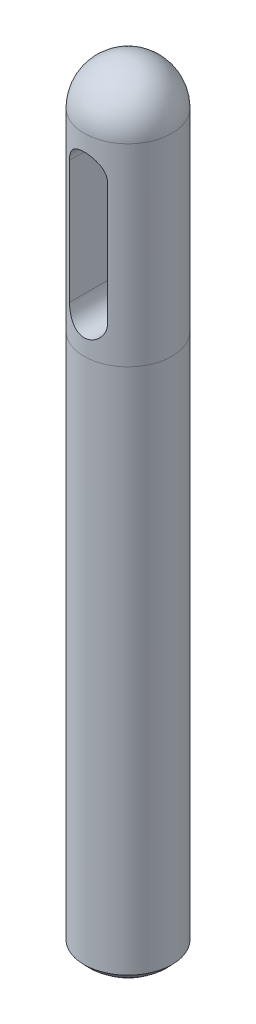
ISO-10303-21;
HEADER;
FILE_DESCRIPTION(('STEP AP214'),'2;1');
FILE_NAME('part.step','',(''),(''),'','','');
FILE_SCHEMA(('AUTOMOTIVE_DESIGN { 1 0 10303 214 1 1 1 1 }'));
ENDSEC;
DATA;
#1=APPLICATION_CONTEXT('core data for automotive mechanical design processes');
#2=APPLICATION_PROTOCOL_DEFINITION('international standard','automotive_design',2000,#1);
#3=PRODUCT_CONTEXT('',#1,'mechanical');
#4=PRODUCT('Part','Part','',(#3));
#5=PRODUCT_RELATED_PRODUCT_CATEGORY('part','',(#4));
#6=PRODUCT_DEFINITION_FORMATION('','',#4);
#7=PRODUCT_DEFINITION_CONTEXT('part definition',#1,'design');
#8=PRODUCT_DEFINITION('design','',#6,#7);
#9=PRODUCT_DEFINITION_SHAPE('','',#8);
#10=(LENGTH_UNIT() NAMED_UNIT(*) SI_UNIT(.MILLI.,.METRE.));
#11=(NAMED_UNIT(*) PLANE_ANGLE_UNIT() SI_UNIT($,.RADIAN.));
#12=(NAMED_UNIT(*) SI_UNIT($,.STERADIAN.) SOLID_ANGLE_UNIT());
#13=UNCERTAINTY_MEASURE_WITH_UNIT(LENGTH_MEASURE(1.E-05),#10,'distance_accuracy_value','');
#14=(GEOMETRIC_REPRESENTATION_CONTEXT(3) GLOBAL_UNCERTAINTY_ASSIGNED_CONTEXT((#13)) GLOBAL_UNIT_ASSIGNED_CONTEXT((#10,
#11,#12)) REPRESENTATION_CONTEXT('',''));
#15=CARTESIAN_POINT('',(0.,0.,0.));
#16=DIRECTION('',(0.,0.,1.));
#17=DIRECTION('',(1.,0.,0.));
#18=AXIS2_PLACEMENT_3D('',#15,#16,#17);
#19=CARTESIAN_POINT('',(0.,0.,0.));
#20=DIRECTION('',(0.,-1.,0.));
#21=DIRECTION('',(1.,0.,0.));
#22=AXIS2_PLACEMENT_3D('',#19,#20,#21);
#23=CYLINDRICAL_SURFACE('',#22,2.49771864426145);
#24=CARTESIAN_POINT('',(-1.08156310943295,32.,2.25140393226204));
#25=CARTESIAN_POINT('',(-1.08156462459326,31.9711286747839,2.25139958166966));
#26=CARTESIAN_POINT('',(-1.08040632023386,31.9422729112845,2.2519599835213));
#27=CARTESIAN_POINT('',(-1.07579662459928,31.884799648412,2.25416724154309));
#28=CARTESIAN_POINT('',(-1.07234626010404,31.8561820481581,2.2558136112272));
#29=CARTESIAN_POINT('',(-1.05864428238476,31.7712616524154,2.26229476426738));
#30=CARTESIAN_POINT('',(-1.04504111585666,31.7155787319075,2.26867251849921));
#31=CARTESIAN_POINT('',(-1.00947281413111,31.6075996259835,2.2847181118528));
#32=CARTESIAN_POINT('',(-0.987518788030334,31.5552990487394,2.29438157820754));
#33=CARTESIAN_POINT('',(-0.935946284783608,31.4550559864309,2.31589778574997));
#34=CARTESIAN_POINT('',(-0.906319100733386,31.4071185363628,2.32775300957213));
#35=CARTESIAN_POINT('',(-0.838144605373987,31.3138298654569,2.35319179935182));
#36=CARTESIAN_POINT('',(-0.799166139929148,31.2688104634779,2.36683653303169));
#37=CARTESIAN_POINT('',(-0.714304200124362,31.1857049623009,2.39381481322249));
#38=CARTESIAN_POINT('',(-0.668419185045317,31.1476204143358,2.40714828952929));
#39=CARTESIAN_POINT('',(-0.568362170274591,31.077697998134,2.43276606280889));
#40=CARTESIAN_POINT('',(-0.513899661221928,31.0462437958692,2.44497020050376));
#41=CARTESIAN_POINT('',(-0.399831615298517,30.9930904503985,2.46618942496456));
#42=CARTESIAN_POINT('',(-0.34022856708859,30.9713866180488,2.47520604422497));
#43=CARTESIAN_POINT('',(-0.221090787555007,30.9395829618202,2.48859553037197));
#44=CARTESIAN_POINT('',(-0.161737024527661,30.9289043323787,2.49319900035269));
#45=CARTESIAN_POINT('',(-0.0419127081988314,30.917577191197,2.49808545305704));
#46=CARTESIAN_POINT('',(0.0185573626019191,30.9169244431075,2.49837026059347));
#47=CARTESIAN_POINT('',(0.134663205025993,30.9253791851233,2.49471814831445));
#48=CARTESIAN_POINT('',(0.190355778547205,30.9338488893024,2.49105708801906));
#49=CARTESIAN_POINT('',(0.299436898530217,30.9592058877851,2.48031061488009));
#50=CARTESIAN_POINT('',(0.352825316203856,30.9760936519462,2.47322501089487));
#51=CARTESIAN_POINT('',(0.456772250557376,31.0179981768929,2.4561711192019));
#52=CARTESIAN_POINT('',(0.507274959263889,31.0431353798874,2.4461603774617));
#53=CARTESIAN_POINT('',(0.603478978501939,31.100701714955,2.4242214758111));
#54=CARTESIAN_POINT('',(0.649178483032814,31.1331335755233,2.41229259891824));
#55=CARTESIAN_POINT('',(0.738132563995412,31.2071975802337,2.38664197772926));
#56=CARTESIAN_POINT('',(0.780944950888979,31.2493381351035,2.37285286806837));
#57=CARTESIAN_POINT('',(0.859101043969513,31.3402136469453,2.345689582573));
#58=CARTESIAN_POINT('',(0.894440521948129,31.3889523117182,2.33231564527655));
#59=CARTESIAN_POINT('',(0.957925056132105,31.493970188979,2.30698789419763));
#60=CARTESIAN_POINT('',(0.985741598330913,31.5504671433012,2.29510836792315));
#61=CARTESIAN_POINT('',(1.03125108907204,31.6679603426171,2.27502665949609));
#62=CARTESIAN_POINT('',(1.04896352433434,31.728947669137,2.26681740553948));
#63=CARTESIAN_POINT('',(1.06796112726464,31.825463475418,2.25789963831446));
#64=CARTESIAN_POINT('',(1.07305133691001,31.8601254199463,2.25547827556735));
#65=CARTESIAN_POINT('',(1.07985476427237,31.9298499194921,2.25222502257327));
#66=CARTESIAN_POINT('',(1.08156817645313,31.9649124513236,2.25139304079675));
#67=CARTESIAN_POINT('',(1.08156310943295,32.,2.25140393226204));
#68=B_SPLINE_CURVE_WITH_KNOTS('',3,(#24,#25,#26,#27,#28,#29,#30,#31,#32,#33,#34,#35,#36,#37,#38,
#39,#40,#41,#42,#43,#44,#45,#46,#47,#48,#49,#50,#51,#52,#53,#54,#55,#56,#57,#58,#59,#60,#61,#62,
#63,#64,#65,#66,#67),.UNSPECIFIED.,.F.,.F.,(4,2,2,2,2,2,2,2,2,2,2,2,2,2,2,2,2,2,2,2,2,4),(0.,
0.0865553543810283,0.173071960467418,0.345180576833628,0.517061034391303,0.689137389656105,
0.871622085499794,1.05414755068785,1.24536184869989,1.43648408931196,1.61696501914358,
1.79736968622059,1.96593377826644,2.13450727983994,2.30566043913408,2.47687772336942,
2.66096868076579,2.84516352066217,3.03643400820074,3.22733435454474,3.33250448052577,
3.43766854976892),.UNSPECIFIED.);
#69=CARTESIAN_POINT('',(-1.08156310943295,32.,2.25140393226204));
#70=VERTEX_POINT('',#69);
#71=CARTESIAN_POINT('',(1.08156310943295,32.,2.25140393226204));
#72=VERTEX_POINT('',#71);
#73=EDGE_CURVE('E97',#70,#72,#68,.T.);
#74=ORIENTED_EDGE('',*,*,#73,.F.);
#75=DIRECTION('',(0.,-1.,0.));
#76=VECTOR('',#75,1.);
#77=CARTESIAN_POINT('',(-1.08156310943295,0.,2.25140393226204));
#78=LINE('',#77,#76);
#79=CARTESIAN_POINT('',(-1.08156310943295,39.,2.25140393226204));
#80=VERTEX_POINT('',#79);
#81=EDGE_CURVE('E136',#70,#80,#78,.F.);
#82=ORIENTED_EDGE('',*,*,#81,.T.);
#83=CARTESIAN_POINT('',(1.08156310943295,39.,2.25140393226204));
#84=CARTESIAN_POINT('',(1.08156462459326,39.0288713252161,2.25139958166966));
#85=CARTESIAN_POINT('',(1.08040632023386,39.0577270887156,2.2519599835213));
#86=CARTESIAN_POINT('',(1.07579662459928,39.115200351588,2.25416724154309));
#87=CARTESIAN_POINT('',(1.07234626010404,39.1438179518419,2.2558136112272));
#88=CARTESIAN_POINT('',(1.05864428238476,39.2287383475846,2.26229476426738));
#89=CARTESIAN_POINT('',(1.04504111585666,39.2844212680925,2.26867251849921));
#90=CARTESIAN_POINT('',(1.00947281413111,39.3924003740165,2.2847181118528));
#91=CARTESIAN_POINT('',(0.987518788030338,39.4447009512606,2.29438157820753));
#92=CARTESIAN_POINT('',(0.935946284783614,39.5449440135691,2.31589778574997));
#93=CARTESIAN_POINT('',(0.906319100733394,39.5928814636372,2.32775300957213));
#94=CARTESIAN_POINT('',(0.838144605373996,39.6861701345431,2.35319179935182));
#95=CARTESIAN_POINT('',(0.799166139929157,39.7311895365221,2.36683653303168));
#96=CARTESIAN_POINT('',(0.714304200124368,39.8142950376991,2.39381481322248));
#97=CARTESIAN_POINT('',(0.668419185045323,39.8523795856642,2.40714828952929));
#98=CARTESIAN_POINT('',(0.568362170274597,39.922302001866,2.43276606280889));
#99=CARTESIAN_POINT('',(0.513899661221936,39.9537562041308,2.44497020050375));
#100=CARTESIAN_POINT('',(0.399831615298526,40.0069095496015,2.46618942496456));
#101=CARTESIAN_POINT('',(0.340228567088599,40.0286133819511,2.47520604422497));
#102=CARTESIAN_POINT('',(0.221090787555017,40.0604170381798,2.48859553037197));
#103=CARTESIAN_POINT('',(0.161737024527672,40.0710956676213,2.49319900035269));
#104=CARTESIAN_POINT('',(0.0419127081988437,40.082422808803,2.49808545305704));
#105=CARTESIAN_POINT('',(-0.0185573626019069,40.0830755568925,2.49837026059347));
#106=CARTESIAN_POINT('',(-0.134663205025981,40.0746208148767,2.49471814831445));
#107=CARTESIAN_POINT('',(-0.190355778547195,40.0661511106976,2.49105708801907));
#108=CARTESIAN_POINT('',(-0.299436898530207,40.0407941122149,2.48031061488009));
#109=CARTESIAN_POINT('',(-0.352825316203846,40.0239063480538,2.47322501089487));
#110=CARTESIAN_POINT('',(-0.456772250557365,39.9820018231071,2.4561711192019));
#111=CARTESIAN_POINT('',(-0.507274959263876,39.9568646201126,2.4461603774617));
#112=CARTESIAN_POINT('',(-0.603478978501927,39.8992982850451,2.42422147581111));
#113=CARTESIAN_POINT('',(-0.649178483032804,39.8668664244768,2.41229259891824));
#114=CARTESIAN_POINT('',(-0.738132563995404,39.7928024197664,2.38664197772927));
#115=CARTESIAN_POINT('',(-0.780944950888971,39.7506618648965,2.37285286806837));
#116=CARTESIAN_POINT('',(-0.859101043969505,39.6597863530547,2.345689582573));
#117=CARTESIAN_POINT('',(-0.894440521948121,39.6110476882818,2.33231564527656));
#118=CARTESIAN_POINT('',(-0.957925056132098,39.506029811021,2.30698789419763));
#119=CARTESIAN_POINT('',(-0.985741598330907,39.4495328566988,2.29510836792316));
#120=CARTESIAN_POINT('',(-1.03125108907204,39.3320396573829,2.27502665949609));
#121=CARTESIAN_POINT('',(-1.04896352433433,39.271052330863,2.26681740553949));
#122=CARTESIAN_POINT('',(-1.06796112726464,39.174536524582,2.25789963831446));
#123=CARTESIAN_POINT('',(-1.07305133691001,39.1398745800537,2.25547827556735));
#124=CARTESIAN_POINT('',(-1.07985476427237,39.0701500805079,2.25222502257327));
#125=CARTESIAN_POINT('',(-1.08156817645313,39.0350875486764,2.25139304079675));
#126=CARTESIAN_POINT('',(-1.08156310943295,39.,2.25140393226204));
#127=B_SPLINE_CURVE_WITH_KNOTS('',3,(#83,#84,#85,#86,#87,#88,#89,#90,#91,#92,#93,#94,#95,#96,
#97,#98,#99,#100,#101,#102,#103,#104,#105,#106,#107,#108,#109,#110,#111,#112,#113,#114,#115,
#116,#117,#118,#119,#120,#121,#122,#123,#124,#125,#126),.UNSPECIFIED.,.F.,.F.,(4,2,2,2,2,2,2,2,
2,2,2,2,2,2,2,2,2,2,2,2,2,4),(0.,0.0865553543810283,0.173071960467411,0.345180576833621,
0.517061034391295,0.689137389656087,0.871622085499787,1.05414755068784,1.24536184869988,
1.43648408931195,1.61696501914357,1.79736968622057,1.96593377826642,2.13450727983993,
2.30566043913406,2.47687772336941,2.66096868076577,2.84516352066215,3.03643400820072,
3.22733435454473,3.33250448052576,3.43766854976892),.UNSPECIFIED.);
#128=CARTESIAN_POINT('',(1.08156310943295,39.,2.25140393226204));
#129=VERTEX_POINT('',#128);
#130=EDGE_CURVE('E104',#129,#80,#127,.T.);
#131=ORIENTED_EDGE('',*,*,#130,.F.);
#132=DIRECTION('',(0.,-1.,0.));
#133=VECTOR('',#132,1.);
#134=CARTESIAN_POINT('',(1.08156310943295,0.,2.25140393226204));
#135=LINE('',#134,#133);
#136=EDGE_CURVE('E135',#72,#129,#135,.F.);
#137=ORIENTED_EDGE('',*,*,#136,.F.);
#138=EDGE_LOOP('',(#74,#82,#131,#137));
#139=FACE_BOUND('',#138,.T.);
#140=CARTESIAN_POINT('',(0.,30.,0.));
#141=DIRECTION('',(0.,1.,0.));
#142=DIRECTION('',(1.,0.,0.));
#143=AXIS2_PLACEMENT_3D('',#140,#141,#142);
#144=CIRCLE('',#143,2.49771864426145);
#145=CARTESIAN_POINT('',(2.49771864426144,30.,0.));
#146=VERTEX_POINT('',#145);
#147=EDGE_CURVE('E168',#146,#146,#144,.T.);
#148=ORIENTED_EDGE('',*,*,#147,.T.);
#149=EDGE_LOOP('',(#148));
#150=FACE_BOUND('',#149,.T.);
#151=CARTESIAN_POINT('',(0.,41.,0.));
#152=DIRECTION('',(0.,-1.,0.));
#153=DIRECTION('',(1.,0.,0.));
#154=AXIS2_PLACEMENT_3D('',#151,#152,#153);
#155=CIRCLE('',#154,2.49771864426145);
#156=CARTESIAN_POINT('',(2.49771864426144,41.,0.));
#157=VERTEX_POINT('',#156);
#158=EDGE_CURVE('E172',#157,#157,#155,.T.);
#159=ORIENTED_EDGE('',*,*,#158,.T.);
#160=EDGE_LOOP('',(#159));
#161=FACE_BOUND('',#160,.T.);
#162=CARTESIAN_POINT('',(1.08156310943295,32.,-2.25140393226204));
#163=CARTESIAN_POINT('',(1.08156462459326,31.9711286747839,-2.25139958166966));
#164=CARTESIAN_POINT('',(1.08040632023386,31.9422729112845,-2.2519599835213));
#165=CARTESIAN_POINT('',(1.07579662459928,31.884799648412,-2.25416724154309));
#166=CARTESIAN_POINT('',(1.07234626010404,31.8561820481581,-2.2558136112272));
#167=CARTESIAN_POINT('',(1.05864428238476,31.7712616524154,-2.26229476426738));
#168=CARTESIAN_POINT('',(1.04504111585666,31.7155787319075,-2.26867251849921));
#169=CARTESIAN_POINT('',(1.00947281413111,31.6075996259835,-2.2847181118528));
#170=CARTESIAN_POINT('',(0.987518788030334,31.5552990487394,-2.29438157820754));
#171=CARTESIAN_POINT('',(0.935946284783608,31.4550559864309,-2.31589778574997));
#172=CARTESIAN_POINT('',(0.906319100733386,31.4071185363628,-2.32775300957213));
#173=CARTESIAN_POINT('',(0.838144605373987,31.3138298654569,-2.35319179935182));
#174=CARTESIAN_POINT('',(0.799166139929148,31.2688104634779,-2.36683653303169));
#175=CARTESIAN_POINT('',(0.714304200124362,31.1857049623009,-2.39381481322248));
#176=CARTESIAN_POINT('',(0.668419185045317,31.1476204143358,-2.40714828952929));
#177=CARTESIAN_POINT('',(0.568362170274591,31.077697998134,-2.43276606280889));
#178=CARTESIAN_POINT('',(0.513899661221928,31.0462437958692,-2.44497020050376));
#179=CARTESIAN_POINT('',(0.399831615298517,30.9930904503985,-2.46618942496456));
#180=CARTESIAN_POINT('',(0.34022856708859,30.9713866180488,-2.47520604422497));
#181=CARTESIAN_POINT('',(0.221090787555007,30.9395829618202,-2.48859553037197));
#182=CARTESIAN_POINT('',(0.161737024527661,30.9289043323787,-2.49319900035269));
#183=CARTESIAN_POINT('',(0.0419127081988318,30.917577191197,-2.49808545305704));
#184=CARTESIAN_POINT('',(-0.018557362601919,30.9169244431075,-2.49837026059347));
#185=CARTESIAN_POINT('',(-0.134663205025993,30.9253791851233,-2.49471814831445));
#186=CARTESIAN_POINT('',(-0.190355778547206,30.9338488893024,-2.49105708801906));
#187=CARTESIAN_POINT('',(-0.299436898530217,30.9592058877851,-2.48031061488009));
#188=CARTESIAN_POINT('',(-0.352825316203856,30.9760936519462,-2.47322501089487));
#189=CARTESIAN_POINT('',(-0.456772250557376,31.0179981768929,-2.4561711192019));
#190=CARTESIAN_POINT('',(-0.507274959263887,31.0431353798874,-2.4461603774617));
#191=CARTESIAN_POINT('',(-0.603478978501937,31.100701714955,-2.4242214758111));
#192=CARTESIAN_POINT('',(-0.649178483032813,31.1331335755233,-2.41229259891824));
#193=CARTESIAN_POINT('',(-0.738132563995412,31.2071975802337,-2.38664197772927));
#194=CARTESIAN_POINT('',(-0.780944950888979,31.2493381351035,-2.37285286806837));
#195=CARTESIAN_POINT('',(-0.859101043969513,31.3402136469453,-2.345689582573));
#196=CARTESIAN_POINT('',(-0.894440521948129,31.3889523117182,-2.33231564527655));
#197=CARTESIAN_POINT('',(-0.957925056132105,31.493970188979,-2.30698789419763));
#198=CARTESIAN_POINT('',(-0.985741598330913,31.5504671433012,-2.29510836792316));
#199=CARTESIAN_POINT('',(-1.03125108907204,31.6679603426171,-2.27502665949609));
#200=CARTESIAN_POINT('',(-1.04896352433434,31.728947669137,-2.26681740553949));
#201=CARTESIAN_POINT('',(-1.06796112726464,31.825463475418,-2.25789963831446));
#202=CARTESIAN_POINT('',(-1.07305133691001,31.8601254199463,-2.25547827556735));
#203=CARTESIAN_POINT('',(-1.07985476427237,31.9298499194921,-2.25222502257327));
#204=CARTESIAN_POINT('',(-1.08156817645313,31.9649124513236,-2.25139304079675));
#205=CARTESIAN_POINT('',(-1.08156310943295,32.,-2.25140393226204));
#206=B_SPLINE_CURVE_WITH_KNOTS('',3,(#162,#163,#164,#165,#166,#167,#168,#169,#170,#171,#172,
#173,#174,#175,#176,#177,#178,#179,#180,#181,#182,#183,#184,#185,#186,#187,#188,#189,#190,#191,
#192,#193,#194,#195,#196,#197,#198,#199,#200,#201,#202,#203,#204,#205),.UNSPECIFIED.,.F.,.F.,(4,
2,2,2,2,2,2,2,2,2,2,2,2,2,2,2,2,2,2,2,2,4),(0.,0.0865553543810283,0.173071960467418,
0.345180576833628,0.517061034391303,0.689137389656105,0.871622085499794,1.05414755068785,
1.24536184869989,1.43648408931196,1.61696501914358,1.79736968622059,1.96593377826644,
2.13450727983994,2.30566043913407,2.47687772336942,2.66096868076579,2.84516352066217,
3.03643400820074,3.22733435454474,3.33250448052576,3.43766854976892),.UNSPECIFIED.);
#207=CARTESIAN_POINT('',(1.08156310943295,32.,-2.25140393226204));
#208=VERTEX_POINT('',#207);
#209=CARTESIAN_POINT('',(-1.08156310943295,32.,-2.25140393226204));
#210=VERTEX_POINT('',#209);
#211=EDGE_CURVE('E11',#208,#210,#206,.T.);
#212=ORIENTED_EDGE('',*,*,#211,.F.);
#213=DIRECTION('',(0.,-1.,0.));
#214=VECTOR('',#213,1.);
#215=CARTESIAN_POINT('',(1.08156310943295,0.,-2.25140393226204));
#216=LINE('',#215,#214);
#217=CARTESIAN_POINT('',(1.08156310943295,39.,-2.25140393226204));
#218=VERTEX_POINT('',#217);
#219=EDGE_CURVE('E61',#218,#208,#216,.T.);
#220=ORIENTED_EDGE('',*,*,#219,.F.);
#221=CARTESIAN_POINT('',(-1.08156310943295,39.,-2.25140393226204));
#222=CARTESIAN_POINT('',(-1.08156462459326,39.0288713252161,-2.25139958166966));
#223=CARTESIAN_POINT('',(-1.08040632023386,39.0577270887156,-2.2519599835213));
#224=CARTESIAN_POINT('',(-1.07579662459928,39.115200351588,-2.25416724154309));
#225=CARTESIAN_POINT('',(-1.07234626010404,39.1438179518419,-2.2558136112272));
#226=CARTESIAN_POINT('',(-1.05864428238476,39.2287383475846,-2.26229476426738));
#227=CARTESIAN_POINT('',(-1.04504111585666,39.2844212680925,-2.26867251849921));
#228=CARTESIAN_POINT('',(-1.00947281413111,39.3924003740165,-2.2847181118528));
#229=CARTESIAN_POINT('',(-0.987518788030335,39.4447009512606,-2.29438157820754));
#230=CARTESIAN_POINT('',(-0.935946284783611,39.5449440135691,-2.31589778574997));
#231=CARTESIAN_POINT('',(-0.906319100733393,39.5928814636372,-2.32775300957213));
#232=CARTESIAN_POINT('',(-0.838144605373997,39.6861701345431,-2.35319179935182));
#233=CARTESIAN_POINT('',(-0.799166139929156,39.7311895365221,-2.36683653303169));
#234=CARTESIAN_POINT('',(-0.714304200124367,39.8142950376991,-2.39381481322248));
#235=CARTESIAN_POINT('',(-0.668419185045323,39.8523795856642,-2.40714828952929));
#236=CARTESIAN_POINT('',(-0.568362170274597,39.922302001866,-2.43276606280889));
#237=CARTESIAN_POINT('',(-0.513899661221936,39.9537562041308,-2.44497020050375));
#238=CARTESIAN_POINT('',(-0.399831615298525,40.0069095496015,-2.46618942496456));
#239=CARTESIAN_POINT('',(-0.340228567088599,40.0286133819511,-2.47520604422497));
#240=CARTESIAN_POINT('',(-0.221090787555017,40.0604170381798,-2.48859553037197));
#241=CARTESIAN_POINT('',(-0.161737024527672,40.0710956676213,-2.49319900035269));
#242=CARTESIAN_POINT('',(-0.0419127081988439,40.082422808803,-2.49808545305704));
#243=CARTESIAN_POINT('',(0.0185573626019066,40.0830755568925,-2.49837026059347));
#244=CARTESIAN_POINT('',(0.134663205025981,40.0746208148767,-2.49471814831445));
#245=CARTESIAN_POINT('',(0.190355778547194,40.0661511106976,-2.49105708801906));
#246=CARTESIAN_POINT('',(0.299436898530206,40.0407941122149,-2.48031061488009));
#247=CARTESIAN_POINT('',(0.352825316203845,40.0239063480538,-2.47322501089487));
#248=CARTESIAN_POINT('',(0.456772250557365,39.9820018231071,-2.4561711192019));
#249=CARTESIAN_POINT('',(0.507274959263876,39.9568646201126,-2.4461603774617));
#250=CARTESIAN_POINT('',(0.603478978501926,39.8992982850451,-2.4242214758111));
#251=CARTESIAN_POINT('',(0.649178483032804,39.8668664244768,-2.41229259891824));
#252=CARTESIAN_POINT('',(0.738132563995401,39.7928024197664,-2.38664197772927));
#253=CARTESIAN_POINT('',(0.780944950888966,39.7506618648965,-2.37285286806837));
#254=CARTESIAN_POINT('',(0.859101043969501,39.6597863530547,-2.345689582573));
#255=CARTESIAN_POINT('',(0.89444052194812,39.6110476882818,-2.33231564527656));
#256=CARTESIAN_POINT('',(0.957925056132098,39.506029811021,-2.30698789419763));
#257=CARTESIAN_POINT('',(0.985741598330906,39.4495328566988,-2.29510836792316));
#258=CARTESIAN_POINT('',(1.03125108907204,39.3320396573829,-2.27502665949609));
#259=CARTESIAN_POINT('',(1.04896352433433,39.271052330863,-2.26681740553949));
#260=CARTESIAN_POINT('',(1.06796112726464,39.174536524582,-2.25789963831446));
#261=CARTESIAN_POINT('',(1.07305133691001,39.1398745800537,-2.25547827556735));
#262=CARTESIAN_POINT('',(1.07985476427237,39.0701500805079,-2.25222502257327));
#263=CARTESIAN_POINT('',(1.08156817645313,39.0350875486764,-2.25139304079675));
#264=CARTESIAN_POINT('',(1.08156310943295,39.,-2.25140393226204));
#265=B_SPLINE_CURVE_WITH_KNOTS('',3,(#221,#222,#223,#224,#225,#226,#227,#228,#229,#230,#231,
#232,#233,#234,#235,#236,#237,#238,#239,#240,#241,#242,#243,#244,#245,#246,#247,#248,#249,#250,
#251,#252,#253,#254,#255,#256,#257,#258,#259,#260,#261,#262,#263,#264),.UNSPECIFIED.,.F.,.F.,(4,
2,2,2,2,2,2,2,2,2,2,2,2,2,2,2,2,2,2,2,2,4),(0.,0.0865553543810283,0.173071960467411,
0.345180576833621,0.517061034391303,0.689137389656087,0.871622085499781,1.05414755068784,
1.24536184869988,1.43648408931195,1.61696501914357,1.79736968622057,1.96593377826642,
2.13450727983993,2.30566043913406,2.4768777233694,2.66096868076576,2.84516352066215,
3.03643400820073,3.22733435454472,3.33250448052576,3.43766854976892),.UNSPECIFIED.);
#266=CARTESIAN_POINT('',(-1.08156310943295,39.,-2.25140393226204));
#267=VERTEX_POINT('',#266);
#268=EDGE_CURVE('E96',#267,#218,#265,.T.);
#269=ORIENTED_EDGE('',*,*,#268,.F.);
#270=DIRECTION('',(0.,-1.,0.));
#271=VECTOR('',#270,1.);
#272=CARTESIAN_POINT('',(-1.08156310943295,0.,-2.25140393226204));
#273=LINE('',#272,#271);
#274=EDGE_CURVE('E90',#267,#210,#273,.T.);
#275=ORIENTED_EDGE('',*,*,#274,.T.);
#276=EDGE_LOOP('',(#212,#220,#269,#275));
#277=FACE_BOUND('',#276,.T.);
#278=ADVANCED_FACE('F45',(#139,#150,#161,#277),#23,.T.);
#279=CARTESIAN_POINT('',(0.,30.,0.));
#280=DIRECTION('',(0.,-1.,0.));
#281=DIRECTION('',(0.,0.,-1.));
#282=AXIS2_PLACEMENT_3D('',#279,#280,#281);
#283=CYLINDRICAL_SURFACE('',#282,2.5);
#284=ORIENTED_EDGE('',*,*,#147,.F.);
#285=EDGE_LOOP('',(#284));
#286=FACE_BOUND('',#285,.T.);
#287=CARTESIAN_POINT('',(0.,0.,0.));
#288=DIRECTION('',(0.,-1.,0.));
#289=DIRECTION('',(1.,0.,0.));
#290=AXIS2_PLACEMENT_3D('',#287,#288,#289);
#291=CIRCLE('',#290,2.5);
#292=CARTESIAN_POINT('',(2.5,0.,0.));
#293=VERTEX_POINT('',#292);
#294=EDGE_CURVE('E200',#293,#293,#291,.T.);
#295=ORIENTED_EDGE('',*,*,#294,.F.);
#296=EDGE_LOOP('',(#295));
#297=FACE_BOUND('',#296,.T.);
#298=ADVANCED_FACE('F47',(#286,#297),#283,.T.);
#299=CARTESIAN_POINT('',(0.,41.,0.));
#300=DIRECTION('',(0.,-1.,0.));
#301=DIRECTION('',(-1.,0.,0.));
#302=AXIS2_PLACEMENT_3D('',#299,#300,#301);
#303=SPHERICAL_SURFACE('',#302,2.49771864426145);
#304=ORIENTED_EDGE('',*,*,#158,.F.);
#305=EDGE_LOOP('',(#304));
#306=FACE_BOUND('',#305,.T.);
#307=ADVANCED_FACE('F147',(#306),#303,.T.);
#308=CARTESIAN_POINT('',(0.,32.,20.));
#309=DIRECTION('',(0.,0.,-1.));
#310=DIRECTION('',(-1.,0.,0.));
#311=AXIS2_PLACEMENT_3D('',#308,#309,#310);
#312=CYLINDRICAL_SURFACE('',#311,1.08156310943295);
#313=ORIENTED_EDGE('',*,*,#73,.T.);
#314=DIRECTION('',(0.,0.,-1.));
#315=VECTOR('',#314,1.);
#316=CARTESIAN_POINT('',(1.08156310943295,32.,20.));
#317=LINE('',#316,#315);
#318=EDGE_CURVE('E174',#72,#208,#317,.T.);
#319=ORIENTED_EDGE('',*,*,#318,.T.);
#320=ORIENTED_EDGE('',*,*,#211,.T.);
#321=DIRECTION('',(0.,0.,-1.));
#322=VECTOR('',#321,1.);
#323=CARTESIAN_POINT('',(-1.08156310943295,32.,20.));
#324=LINE('',#323,#322);
#325=EDGE_CURVE('E68',#70,#210,#324,.T.);
#326=ORIENTED_EDGE('',*,*,#325,.F.);
#327=EDGE_LOOP('',(#313,#319,#320,#326));
#328=FACE_BOUND('',#327,.T.);
#329=ADVANCED_FACE('F144',(#328),#312,.F.);
#330=CARTESIAN_POINT('',(1.08156310943295,0.,20.));
#331=DIRECTION('',(-1.,0.,0.));
#332=DIRECTION('',(0.,0.,1.));
#333=AXIS2_PLACEMENT_3D('',#330,#331,#332);
#334=PLANE('',#333);
#335=ORIENTED_EDGE('',*,*,#219,.T.);
#336=ORIENTED_EDGE('',*,*,#318,.F.);
#337=ORIENTED_EDGE('',*,*,#136,.T.);
#338=DIRECTION('',(0.,0.,-1.));
#339=VECTOR('',#338,1.);
#340=CARTESIAN_POINT('',(1.08156310943295,39.,20.));
#341=LINE('',#340,#339);
#342=EDGE_CURVE('E107',#129,#218,#341,.T.);
#343=ORIENTED_EDGE('',*,*,#342,.T.);
#344=EDGE_LOOP('',(#335,#336,#337,#343));
#345=FACE_BOUND('',#344,.T.);
#346=ADVANCED_FACE('F124',(#345),#334,.T.);
#347=CARTESIAN_POINT('',(0.,39.,20.));
#348=DIRECTION('',(0.,0.,-1.));
#349=DIRECTION('',(-1.,0.,0.));
#350=AXIS2_PLACEMENT_3D('',#347,#348,#349);
#351=CYLINDRICAL_SURFACE('',#350,1.08156310943295);
#352=ORIENTED_EDGE('',*,*,#130,.T.);
#353=DIRECTION('',(0.,0.,-1.));
#354=VECTOR('',#353,1.);
#355=CARTESIAN_POINT('',(-1.08156310943295,39.,20.));
#356=LINE('',#355,#354);
#357=EDGE_CURVE('E72',#80,#267,#356,.T.);
#358=ORIENTED_EDGE('',*,*,#357,.T.);
#359=ORIENTED_EDGE('',*,*,#268,.T.);
#360=ORIENTED_EDGE('',*,*,#342,.F.);
#361=EDGE_LOOP('',(#352,#358,#359,#360));
#362=FACE_BOUND('',#361,.T.);
#363=ADVANCED_FACE('F100',(#362),#351,.F.);
#364=CARTESIAN_POINT('',(-1.08156310943295,0.,20.));
#365=DIRECTION('',(-1.,0.,0.));
#366=DIRECTION('',(0.,0.,1.));
#367=AXIS2_PLACEMENT_3D('',#364,#365,#366);
#368=PLANE('',#367);
#369=ORIENTED_EDGE('',*,*,#357,.F.);
#370=ORIENTED_EDGE('',*,*,#81,.F.);
#371=ORIENTED_EDGE('',*,*,#325,.T.);
#372=ORIENTED_EDGE('',*,*,#274,.F.);
#373=EDGE_LOOP('',(#369,#370,#371,#372));
#374=FACE_BOUND('',#373,.T.);
#375=ADVANCED_FACE('F91',(#374),#368,.F.);
#376=CARTESIAN_POINT('',(0.,2.06109575583255,0.));
#377=DIRECTION('',(0.,-1.,0.));
#378=DIRECTION('',(-1.,0.,0.));
#379=AXIS2_PLACEMENT_3D('',#376,#377,#378);
#380=SPHERICAL_SURFACE('',#379,3.24007958462612);
#381=ORIENTED_EDGE('',*,*,#294,.T.);
#382=EDGE_LOOP('',(#381));
#383=FACE_BOUND('',#382,.T.);
#384=ADVANCED_FACE('F209',(#383),#380,.T.);
#385=CLOSED_SHELL('',(#278,#298,#307,#329,#346,#363,#375,#384));
#386=MANIFOLD_SOLID_BREP('B2',#385);
#387=ADVANCED_BREP_SHAPE_REPRESENTATION('',(#18,#386),#14);
#388=SHAPE_DEFINITION_REPRESENTATION(#9,#387);
ENDSEC;
END-ISO-10303-21;
